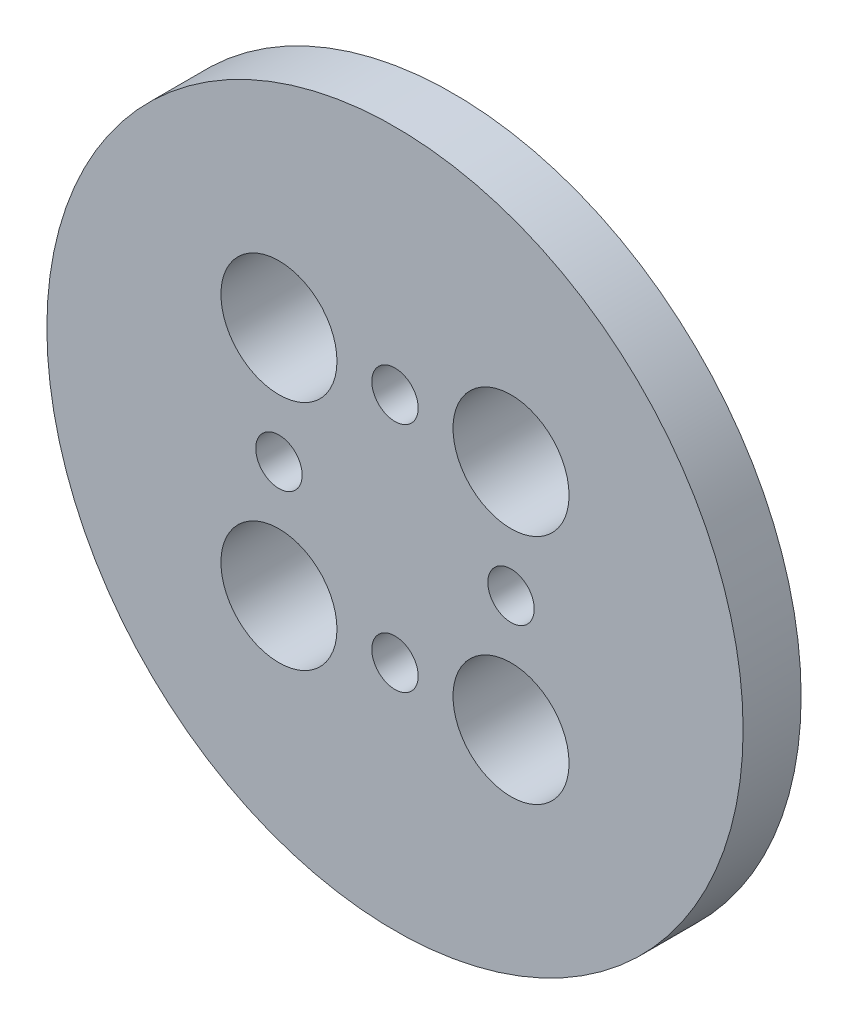
ISO-10303-21;
HEADER;
FILE_DESCRIPTION(('STEP AP214'),'2;1');
FILE_NAME('part.step','',(''),(''),'','','');
FILE_SCHEMA(('AUTOMOTIVE_DESIGN { 1 0 10303 214 1 1 1 1 }'));
ENDSEC;
DATA;
#1=APPLICATION_CONTEXT('core data for automotive mechanical design processes');
#2=APPLICATION_PROTOCOL_DEFINITION('international standard','automotive_design',2000,#1);
#3=PRODUCT_CONTEXT('',#1,'mechanical');
#4=PRODUCT('Part','Part','',(#3));
#5=PRODUCT_RELATED_PRODUCT_CATEGORY('part','',(#4));
#6=PRODUCT_DEFINITION_FORMATION('','',#4);
#7=PRODUCT_DEFINITION_CONTEXT('part definition',#1,'design');
#8=PRODUCT_DEFINITION('design','',#6,#7);
#9=PRODUCT_DEFINITION_SHAPE('','',#8);
#10=(LENGTH_UNIT() NAMED_UNIT(*) SI_UNIT(.MILLI.,.METRE.));
#11=(NAMED_UNIT(*) PLANE_ANGLE_UNIT() SI_UNIT($,.RADIAN.));
#12=(NAMED_UNIT(*) SI_UNIT($,.STERADIAN.) SOLID_ANGLE_UNIT());
#13=UNCERTAINTY_MEASURE_WITH_UNIT(LENGTH_MEASURE(1.E-05),#10,'distance_accuracy_value','');
#14=(GEOMETRIC_REPRESENTATION_CONTEXT(3) GLOBAL_UNCERTAINTY_ASSIGNED_CONTEXT((#13)) GLOBAL_UNIT_ASSIGNED_CONTEXT((#10,
#11,#12)) REPRESENTATION_CONTEXT('',''));
#15=CARTESIAN_POINT('',(0.,0.,0.));
#16=DIRECTION('',(0.,0.,1.));
#17=DIRECTION('',(1.,0.,0.));
#18=AXIS2_PLACEMENT_3D('',#15,#16,#17);
#19=CARTESIAN_POINT('',(0.,0.,5.));
#20=DIRECTION('',(0.,0.,-1.));
#21=DIRECTION('',(-1.,0.,0.));
#22=AXIS2_PLACEMENT_3D('',#19,#20,#21);
#23=CYLINDRICAL_SURFACE('',#22,15.);
#24=CARTESIAN_POINT('',(0.,0.,5.));
#25=DIRECTION('',(0.,0.,1.));
#26=DIRECTION('',(1.,0.,0.));
#27=AXIS2_PLACEMENT_3D('',#24,#25,#26);
#28=CIRCLE('',#27,15.);
#29=CARTESIAN_POINT('',(15.,0.,5.));
#30=VERTEX_POINT('',#29);
#31=EDGE_CURVE('E10',#30,#30,#28,.T.);
#32=ORIENTED_EDGE('',*,*,#31,.F.);
#33=EDGE_LOOP('',(#32));
#34=FACE_BOUND('',#33,.T.);
#35=CARTESIAN_POINT('',(0.,0.,2.5));
#36=DIRECTION('',(0.,0.,-1.));
#37=DIRECTION('',(-1.,0.,0.));
#38=AXIS2_PLACEMENT_3D('',#35,#36,#37);
#39=CIRCLE('',#38,15.);
#40=CARTESIAN_POINT('',(-15.,0.,2.5));
#41=VERTEX_POINT('',#40);
#42=EDGE_CURVE('E43',#41,#41,#39,.T.);
#43=ORIENTED_EDGE('',*,*,#42,.F.);
#44=EDGE_LOOP('',(#43));
#45=FACE_BOUND('',#44,.T.);
#46=ADVANCED_FACE('F36',(#34,#45),#23,.T.);
#47=CARTESIAN_POINT('',(0.,0.,5.));
#48=DIRECTION('',(0.,0.,1.));
#49=DIRECTION('',(1.,0.,0.));
#50=AXIS2_PLACEMENT_3D('',#47,#48,#49);
#51=PLANE('',#50);
#52=CARTESIAN_POINT('',(0.,5.,5.));
#53=DIRECTION('',(0.,0.,1.));
#54=DIRECTION('',(1.,0.,0.));
#55=AXIS2_PLACEMENT_3D('',#52,#53,#54);
#56=CIRCLE('',#55,1.);
#57=CARTESIAN_POINT('',(1.,5.,5.));
#58=VERTEX_POINT('',#57);
#59=EDGE_CURVE('E116',#58,#58,#56,.T.);
#60=ORIENTED_EDGE('',*,*,#59,.F.);
#61=EDGE_LOOP('',(#60));
#62=FACE_BOUND('',#61,.T.);
#63=CARTESIAN_POINT('',(5.,0.,5.));
#64=DIRECTION('',(0.,0.,1.));
#65=DIRECTION('',(1.,0.,0.));
#66=AXIS2_PLACEMENT_3D('',#63,#64,#65);
#67=CIRCLE('',#66,1.00000000000002);
#68=CARTESIAN_POINT('',(6.00000000000002,0.,5.));
#69=VERTEX_POINT('',#68);
#70=EDGE_CURVE('E108',#69,#69,#67,.T.);
#71=ORIENTED_EDGE('',*,*,#70,.F.);
#72=EDGE_LOOP('',(#71));
#73=FACE_BOUND('',#72,.T.);
#74=CARTESIAN_POINT('',(0.,-5.,5.));
#75=DIRECTION('',(0.,0.,1.));
#76=DIRECTION('',(1.,0.,0.));
#77=AXIS2_PLACEMENT_3D('',#74,#75,#76);
#78=CIRCLE('',#77,1.00000000000003);
#79=CARTESIAN_POINT('',(1.00000000000003,-5.,5.));
#80=VERTEX_POINT('',#79);
#81=EDGE_CURVE('E100',#80,#80,#78,.T.);
#82=ORIENTED_EDGE('',*,*,#81,.F.);
#83=EDGE_LOOP('',(#82));
#84=FACE_BOUND('',#83,.T.);
#85=CARTESIAN_POINT('',(-5.,0.,5.));
#86=DIRECTION('',(0.,0.,1.));
#87=DIRECTION('',(1.,0.,0.));
#88=AXIS2_PLACEMENT_3D('',#85,#86,#87);
#89=CIRCLE('',#88,1.00000000000005);
#90=CARTESIAN_POINT('',(-3.99999999999995,0.,5.));
#91=VERTEX_POINT('',#90);
#92=EDGE_CURVE('E92',#91,#91,#89,.T.);
#93=ORIENTED_EDGE('',*,*,#92,.F.);
#94=EDGE_LOOP('',(#93));
#95=FACE_BOUND('',#94,.T.);
#96=CARTESIAN_POINT('',(-5.,-4.99999999999995,5.));
#97=DIRECTION('',(0.,0.,1.));
#98=DIRECTION('',(1.,0.,0.));
#99=AXIS2_PLACEMENT_3D('',#96,#97,#98);
#100=CIRCLE('',#99,2.5);
#101=CARTESIAN_POINT('',(-2.5,-4.99999999999995,5.));
#102=VERTEX_POINT('',#101);
#103=EDGE_CURVE('E68',#102,#102,#100,.T.);
#104=ORIENTED_EDGE('',*,*,#103,.F.);
#105=EDGE_LOOP('',(#104));
#106=FACE_BOUND('',#105,.T.);
#107=CARTESIAN_POINT('',(4.99999999999998,-4.99999999999996,5.));
#108=DIRECTION('',(0.,0.,1.));
#109=DIRECTION('',(1.,0.,0.));
#110=AXIS2_PLACEMENT_3D('',#107,#108,#109);
#111=CIRCLE('',#110,2.5);
#112=CARTESIAN_POINT('',(7.49999999999998,-4.99999999999996,5.));
#113=VERTEX_POINT('',#112);
#114=EDGE_CURVE('E77',#113,#113,#111,.T.);
#115=ORIENTED_EDGE('',*,*,#114,.F.);
#116=EDGE_LOOP('',(#115));
#117=FACE_BOUND('',#116,.T.);
#118=CARTESIAN_POINT('',(5.,4.99999999999999,5.));
#119=DIRECTION('',(0.,0.,1.));
#120=DIRECTION('',(1.,0.,0.));
#121=AXIS2_PLACEMENT_3D('',#118,#119,#120);
#122=CIRCLE('',#121,2.5);
#123=CARTESIAN_POINT('',(7.5,4.99999999999999,5.));
#124=VERTEX_POINT('',#123);
#125=EDGE_CURVE('E85',#124,#124,#122,.T.);
#126=ORIENTED_EDGE('',*,*,#125,.F.);
#127=EDGE_LOOP('',(#126));
#128=FACE_BOUND('',#127,.T.);
#129=CARTESIAN_POINT('',(-5.,5.,5.));
#130=DIRECTION('',(0.,0.,1.));
#131=DIRECTION('',(1.,0.,0.));
#132=AXIS2_PLACEMENT_3D('',#129,#130,#131);
#133=CIRCLE('',#132,2.5);
#134=CARTESIAN_POINT('',(-2.5,5.,5.));
#135=VERTEX_POINT('',#134);
#136=EDGE_CURVE('E60',#135,#135,#133,.T.);
#137=ORIENTED_EDGE('',*,*,#136,.F.);
#138=EDGE_LOOP('',(#137));
#139=FACE_BOUND('',#138,.T.);
#140=ORIENTED_EDGE('',*,*,#31,.T.);
#141=EDGE_LOOP('',(#140));
#142=FACE_BOUND('',#141,.T.);
#143=ADVANCED_FACE('F134',(#62,#73,#84,#95,#106,#117,#128,#139,#142),#51,.T.);
#144=CARTESIAN_POINT('',(0.,0.,2.5));
#145=DIRECTION('',(0.,0.,-1.));
#146=DIRECTION('',(-1.,0.,0.));
#147=AXIS2_PLACEMENT_3D('',#144,#145,#146);
#148=PLANE('',#147);
#149=CARTESIAN_POINT('',(0.,0.,2.5));
#150=DIRECTION('',(0.,0.,-1.));
#151=DIRECTION('',(-1.,0.,0.));
#152=AXIS2_PLACEMENT_3D('',#149,#150,#151);
#153=CIRCLE('',#152,10.);
#154=CARTESIAN_POINT('',(-10.,0.,2.5));
#155=VERTEX_POINT('',#154);
#156=EDGE_CURVE('E48',#155,#155,#153,.T.);
#157=ORIENTED_EDGE('',*,*,#156,.F.);
#158=EDGE_LOOP('',(#157));
#159=FACE_BOUND('',#158,.T.);
#160=ORIENTED_EDGE('',*,*,#42,.T.);
#161=EDGE_LOOP('',(#160));
#162=FACE_BOUND('',#161,.T.);
#163=ADVANCED_FACE('F137',(#159,#162),#148,.T.);
#164=CARTESIAN_POINT('',(0.,0.,2.5));
#165=DIRECTION('',(0.,0.,-1.));
#166=DIRECTION('',(-1.,0.,0.));
#167=AXIS2_PLACEMENT_3D('',#164,#165,#166);
#168=CYLINDRICAL_SURFACE('',#167,10.);
#169=ORIENTED_EDGE('',*,*,#156,.T.);
#170=EDGE_LOOP('',(#169));
#171=FACE_BOUND('',#170,.T.);
#172=CARTESIAN_POINT('',(0.,0.,0.));
#173=DIRECTION('',(0.,0.,-1.));
#174=DIRECTION('',(-1.,0.,0.));
#175=AXIS2_PLACEMENT_3D('',#172,#173,#174);
#176=CIRCLE('',#175,10.);
#177=CARTESIAN_POINT('',(-10.,0.,0.));
#178=VERTEX_POINT('',#177);
#179=EDGE_CURVE('E53',#178,#178,#176,.T.);
#180=ORIENTED_EDGE('',*,*,#179,.F.);
#181=EDGE_LOOP('',(#180));
#182=FACE_BOUND('',#181,.T.);
#183=ADVANCED_FACE('F166',(#171,#182),#168,.T.);
#184=CARTESIAN_POINT('',(0.,0.,0.));
#185=DIRECTION('',(0.,0.,1.));
#186=DIRECTION('',(1.,0.,0.));
#187=AXIS2_PLACEMENT_3D('',#184,#185,#186);
#188=PLANE('',#187);
#189=CARTESIAN_POINT('',(0.,5.,0.));
#190=DIRECTION('',(0.,0.,1.));
#191=DIRECTION('',(1.,0.,0.));
#192=AXIS2_PLACEMENT_3D('',#189,#190,#191);
#193=CIRCLE('',#192,1.);
#194=CARTESIAN_POINT('',(1.,5.,0.));
#195=VERTEX_POINT('',#194);
#196=EDGE_CURVE('E73',#195,#195,#193,.T.);
#197=ORIENTED_EDGE('',*,*,#196,.T.);
#198=EDGE_LOOP('',(#197));
#199=FACE_BOUND('',#198,.T.);
#200=CARTESIAN_POINT('',(5.,0.,0.));
#201=DIRECTION('',(0.,0.,1.));
#202=DIRECTION('',(1.,0.,0.));
#203=AXIS2_PLACEMENT_3D('',#200,#201,#202);
#204=CIRCLE('',#203,1.00000000000002);
#205=CARTESIAN_POINT('',(6.00000000000002,0.,0.));
#206=VERTEX_POINT('',#205);
#207=EDGE_CURVE('E112',#206,#206,#204,.T.);
#208=ORIENTED_EDGE('',*,*,#207,.T.);
#209=EDGE_LOOP('',(#208));
#210=FACE_BOUND('',#209,.T.);
#211=CARTESIAN_POINT('',(0.,-5.,0.));
#212=DIRECTION('',(0.,0.,1.));
#213=DIRECTION('',(1.,0.,0.));
#214=AXIS2_PLACEMENT_3D('',#211,#212,#213);
#215=CIRCLE('',#214,1.00000000000003);
#216=CARTESIAN_POINT('',(1.00000000000003,-5.,0.));
#217=VERTEX_POINT('',#216);
#218=EDGE_CURVE('E104',#217,#217,#215,.T.);
#219=ORIENTED_EDGE('',*,*,#218,.T.);
#220=EDGE_LOOP('',(#219));
#221=FACE_BOUND('',#220,.T.);
#222=CARTESIAN_POINT('',(-5.,0.,0.));
#223=DIRECTION('',(0.,0.,1.));
#224=DIRECTION('',(1.,0.,0.));
#225=AXIS2_PLACEMENT_3D('',#222,#223,#224);
#226=CIRCLE('',#225,1.00000000000005);
#227=CARTESIAN_POINT('',(-3.99999999999995,0.,0.));
#228=VERTEX_POINT('',#227);
#229=EDGE_CURVE('E96',#228,#228,#226,.T.);
#230=ORIENTED_EDGE('',*,*,#229,.T.);
#231=EDGE_LOOP('',(#230));
#232=FACE_BOUND('',#231,.T.);
#233=CARTESIAN_POINT('',(-5.,-4.99999999999995,0.));
#234=DIRECTION('',(0.,0.,1.));
#235=DIRECTION('',(1.,0.,0.));
#236=AXIS2_PLACEMENT_3D('',#233,#234,#235);
#237=CIRCLE('',#236,2.5);
#238=CARTESIAN_POINT('',(-2.5,-4.99999999999995,0.));
#239=VERTEX_POINT('',#238);
#240=EDGE_CURVE('E72',#239,#239,#237,.T.);
#241=ORIENTED_EDGE('',*,*,#240,.T.);
#242=EDGE_LOOP('',(#241));
#243=FACE_BOUND('',#242,.T.);
#244=CARTESIAN_POINT('',(4.99999999999998,-4.99999999999996,0.));
#245=DIRECTION('',(0.,0.,1.));
#246=DIRECTION('',(1.,0.,0.));
#247=AXIS2_PLACEMENT_3D('',#244,#245,#246);
#248=CIRCLE('',#247,2.5);
#249=CARTESIAN_POINT('',(7.49999999999998,-4.99999999999996,0.));
#250=VERTEX_POINT('',#249);
#251=EDGE_CURVE('E81',#250,#250,#248,.T.);
#252=ORIENTED_EDGE('',*,*,#251,.T.);
#253=EDGE_LOOP('',(#252));
#254=FACE_BOUND('',#253,.T.);
#255=CARTESIAN_POINT('',(5.,4.99999999999999,0.));
#256=DIRECTION('',(0.,0.,1.));
#257=DIRECTION('',(1.,0.,0.));
#258=AXIS2_PLACEMENT_3D('',#255,#256,#257);
#259=CIRCLE('',#258,2.5);
#260=CARTESIAN_POINT('',(7.5,4.99999999999999,0.));
#261=VERTEX_POINT('',#260);
#262=EDGE_CURVE('E64',#261,#261,#259,.T.);
#263=ORIENTED_EDGE('',*,*,#262,.T.);
#264=EDGE_LOOP('',(#263));
#265=FACE_BOUND('',#264,.T.);
#266=CARTESIAN_POINT('',(-5.,5.,0.));
#267=DIRECTION('',(0.,0.,1.));
#268=DIRECTION('',(1.,0.,0.));
#269=AXIS2_PLACEMENT_3D('',#266,#267,#268);
#270=CIRCLE('',#269,2.5);
#271=CARTESIAN_POINT('',(-2.5,5.,0.));
#272=VERTEX_POINT('',#271);
#273=EDGE_CURVE('E58',#272,#272,#270,.T.);
#274=ORIENTED_EDGE('',*,*,#273,.T.);
#275=EDGE_LOOP('',(#274));
#276=FACE_BOUND('',#275,.T.);
#277=ORIENTED_EDGE('',*,*,#179,.T.);
#278=EDGE_LOOP('',(#277));
#279=FACE_BOUND('',#278,.T.);
#280=ADVANCED_FACE('F124',(#199,#210,#221,#232,#243,#254,#265,#276,#279),#188,.F.);
#281=CARTESIAN_POINT('',(-5.,5.,0.));
#282=DIRECTION('',(0.,0.,1.));
#283=DIRECTION('',(1.,0.,0.));
#284=AXIS2_PLACEMENT_3D('',#281,#282,#283);
#285=CYLINDRICAL_SURFACE('',#284,2.5);
#286=ORIENTED_EDGE('',*,*,#273,.F.);
#287=EDGE_LOOP('',(#286));
#288=FACE_BOUND('',#287,.T.);
#289=ORIENTED_EDGE('',*,*,#136,.T.);
#290=EDGE_LOOP('',(#289));
#291=FACE_BOUND('',#290,.T.);
#292=ADVANCED_FACE('F153',(#288,#291),#285,.F.);
#293=CARTESIAN_POINT('',(5.,4.99999999999999,0.));
#294=DIRECTION('',(0.,0.,1.));
#295=DIRECTION('',(1.,0.,0.));
#296=AXIS2_PLACEMENT_3D('',#293,#294,#295);
#297=CYLINDRICAL_SURFACE('',#296,2.5);
#298=ORIENTED_EDGE('',*,*,#262,.F.);
#299=EDGE_LOOP('',(#298));
#300=FACE_BOUND('',#299,.T.);
#301=ORIENTED_EDGE('',*,*,#125,.T.);
#302=EDGE_LOOP('',(#301));
#303=FACE_BOUND('',#302,.T.);
#304=ADVANCED_FACE('F155',(#300,#303),#297,.F.);
#305=CARTESIAN_POINT('',(4.99999999999998,-4.99999999999996,0.));
#306=DIRECTION('',(0.,0.,1.));
#307=DIRECTION('',(1.,0.,0.));
#308=AXIS2_PLACEMENT_3D('',#305,#306,#307);
#309=CYLINDRICAL_SURFACE('',#308,2.5);
#310=ORIENTED_EDGE('',*,*,#251,.F.);
#311=EDGE_LOOP('',(#310));
#312=FACE_BOUND('',#311,.T.);
#313=ORIENTED_EDGE('',*,*,#114,.T.);
#314=EDGE_LOOP('',(#313));
#315=FACE_BOUND('',#314,.T.);
#316=ADVANCED_FACE('F162',(#312,#315),#309,.F.);
#317=CARTESIAN_POINT('',(-5.,-4.99999999999995,0.));
#318=DIRECTION('',(0.,0.,1.));
#319=DIRECTION('',(1.,0.,0.));
#320=AXIS2_PLACEMENT_3D('',#317,#318,#319);
#321=CYLINDRICAL_SURFACE('',#320,2.5);
#322=ORIENTED_EDGE('',*,*,#240,.F.);
#323=EDGE_LOOP('',(#322));
#324=FACE_BOUND('',#323,.T.);
#325=ORIENTED_EDGE('',*,*,#103,.T.);
#326=EDGE_LOOP('',(#325));
#327=FACE_BOUND('',#326,.T.);
#328=ADVANCED_FACE('F209',(#324,#327),#321,.F.);
#329=CARTESIAN_POINT('',(-5.,0.,0.));
#330=DIRECTION('',(0.,0.,1.));
#331=DIRECTION('',(1.,0.,0.));
#332=AXIS2_PLACEMENT_3D('',#329,#330,#331);
#333=CYLINDRICAL_SURFACE('',#332,1.00000000000005);
#334=ORIENTED_EDGE('',*,*,#229,.F.);
#335=EDGE_LOOP('',(#334));
#336=FACE_BOUND('',#335,.T.);
#337=ORIENTED_EDGE('',*,*,#92,.T.);
#338=EDGE_LOOP('',(#337));
#339=FACE_BOUND('',#338,.T.);
#340=ADVANCED_FACE('F203',(#336,#339),#333,.F.);
#341=CARTESIAN_POINT('',(0.,-5.,0.));
#342=DIRECTION('',(0.,0.,1.));
#343=DIRECTION('',(1.,0.,0.));
#344=AXIS2_PLACEMENT_3D('',#341,#342,#343);
#345=CYLINDRICAL_SURFACE('',#344,1.00000000000003);
#346=ORIENTED_EDGE('',*,*,#218,.F.);
#347=EDGE_LOOP('',(#346));
#348=FACE_BOUND('',#347,.T.);
#349=ORIENTED_EDGE('',*,*,#81,.T.);
#350=EDGE_LOOP('',(#349));
#351=FACE_BOUND('',#350,.T.);
#352=ADVANCED_FACE('F208',(#348,#351),#345,.F.);
#353=CARTESIAN_POINT('',(5.,0.,0.));
#354=DIRECTION('',(0.,0.,1.));
#355=DIRECTION('',(1.,0.,0.));
#356=AXIS2_PLACEMENT_3D('',#353,#354,#355);
#357=CYLINDRICAL_SURFACE('',#356,1.00000000000002);
#358=ORIENTED_EDGE('',*,*,#207,.F.);
#359=EDGE_LOOP('',(#358));
#360=FACE_BOUND('',#359,.T.);
#361=ORIENTED_EDGE('',*,*,#70,.T.);
#362=EDGE_LOOP('',(#361));
#363=FACE_BOUND('',#362,.T.);
#364=ADVANCED_FACE('F130',(#360,#363),#357,.F.);
#365=CARTESIAN_POINT('',(0.,5.,0.));
#366=DIRECTION('',(0.,0.,1.));
#367=DIRECTION('',(1.,0.,0.));
#368=AXIS2_PLACEMENT_3D('',#365,#366,#367);
#369=CYLINDRICAL_SURFACE('',#368,1.);
#370=ORIENTED_EDGE('',*,*,#196,.F.);
#371=EDGE_LOOP('',(#370));
#372=FACE_BOUND('',#371,.T.);
#373=ORIENTED_EDGE('',*,*,#59,.T.);
#374=EDGE_LOOP('',(#373));
#375=FACE_BOUND('',#374,.T.);
#376=ADVANCED_FACE('F127',(#372,#375),#369,.F.);
#377=CLOSED_SHELL('',(#46,#143,#163,#183,#280,#292,#304,#316,#328,#340,#352,#364,#376));
#378=MANIFOLD_SOLID_BREP('B2',#377);
#379=ADVANCED_BREP_SHAPE_REPRESENTATION('',(#18,#378),#14);
#380=SHAPE_DEFINITION_REPRESENTATION(#9,#379);
ENDSEC;
END-ISO-10303-21;
